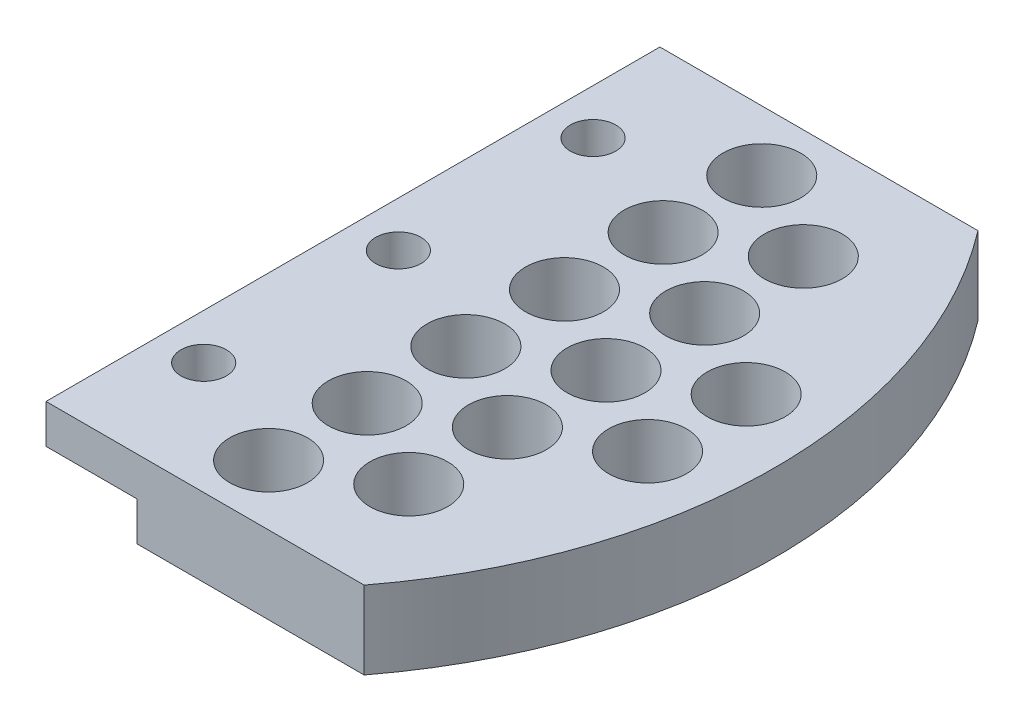
ISO-10303-21;
HEADER;
FILE_DESCRIPTION(('STEP AP214'),'2;1');
FILE_NAME('part.step','',(''),(''),'','','');
FILE_SCHEMA(('AUTOMOTIVE_DESIGN { 1 0 10303 214 1 1 1 1 }'));
ENDSEC;
DATA;
#1=APPLICATION_CONTEXT('core data for automotive mechanical design processes');
#2=APPLICATION_PROTOCOL_DEFINITION('international standard','automotive_design',2000,#1);
#3=PRODUCT_CONTEXT('',#1,'mechanical');
#4=PRODUCT('Part','Part','',(#3));
#5=PRODUCT_RELATED_PRODUCT_CATEGORY('part','',(#4));
#6=PRODUCT_DEFINITION_FORMATION('','',#4);
#7=PRODUCT_DEFINITION_CONTEXT('part definition',#1,'design');
#8=PRODUCT_DEFINITION('design','',#6,#7);
#9=PRODUCT_DEFINITION_SHAPE('','',#8);
#10=(LENGTH_UNIT() NAMED_UNIT(*) SI_UNIT(.MILLI.,.METRE.));
#11=(NAMED_UNIT(*) PLANE_ANGLE_UNIT() SI_UNIT($,.RADIAN.));
#12=(NAMED_UNIT(*) SI_UNIT($,.STERADIAN.) SOLID_ANGLE_UNIT());
#13=UNCERTAINTY_MEASURE_WITH_UNIT(LENGTH_MEASURE(1.E-05),#10,'distance_accuracy_value','');
#14=(GEOMETRIC_REPRESENTATION_CONTEXT(3) GLOBAL_UNCERTAINTY_ASSIGNED_CONTEXT((#13)) GLOBAL_UNIT_ASSIGNED_CONTEXT((#10,
#11,#12)) REPRESENTATION_CONTEXT('',''));
#15=CARTESIAN_POINT('',(0.,0.,0.));
#16=DIRECTION('',(0.,0.,1.));
#17=DIRECTION('',(1.,0.,0.));
#18=AXIS2_PLACEMENT_3D('',#15,#16,#17);
#19=CARTESIAN_POINT('',(13.5,0.,-23.65));
#20=DIRECTION('',(1.,0.,0.));
#21=DIRECTION('',(0.,1.,0.));
#22=AXIS2_PLACEMENT_3D('',#19,#20,#21);
#23=PLANE('',#22);
#24=DIRECTION('',(0.,0.,1.));
#25=VECTOR('',#24,1.);
#26=CARTESIAN_POINT('',(13.5,3.,0.));
#27=LINE('',#26,#25);
#28=CARTESIAN_POINT('',(13.5,3.,-23.65));
#29=VERTEX_POINT('',#28);
#30=CARTESIAN_POINT('',(13.5,3.,23.65));
#31=VERTEX_POINT('',#30);
#32=EDGE_CURVE('E28',#29,#31,#27,.T.);
#33=ORIENTED_EDGE('',*,*,#32,.F.);
#34=DIRECTION('',(0.,1.,0.));
#35=VECTOR('',#34,1.);
#36=CARTESIAN_POINT('',(13.5,6.,-23.65));
#37=LINE('',#36,#35);
#38=CARTESIAN_POINT('',(13.5,0.,-23.65));
#39=VERTEX_POINT('',#38);
#40=EDGE_CURVE('E439',#39,#29,#37,.T.);
#41=ORIENTED_EDGE('',*,*,#40,.F.);
#42=DIRECTION('',(0.,0.,1.));
#43=VECTOR('',#42,1.);
#44=CARTESIAN_POINT('',(13.5,0.,0.));
#45=LINE('',#44,#43);
#46=CARTESIAN_POINT('',(13.5,0.,23.65));
#47=VERTEX_POINT('',#46);
#48=EDGE_CURVE('E11',#39,#47,#45,.T.);
#49=ORIENTED_EDGE('',*,*,#48,.T.);
#50=DIRECTION('',(0.,1.,0.));
#51=VECTOR('',#50,1.);
#52=CARTESIAN_POINT('',(13.5,6.,23.65));
#53=LINE('',#52,#51);
#54=EDGE_CURVE('E277',#47,#31,#53,.T.);
#55=ORIENTED_EDGE('',*,*,#54,.T.);
#56=EDGE_LOOP('',(#33,#41,#49,#55));
#57=FACE_BOUND('',#56,.T.);
#58=ADVANCED_FACE('F17',(#57),#23,.F.);
#59=CARTESIAN_POINT('',(0.,0.,0.));
#60=DIRECTION('',(0.,1.,0.));
#61=DIRECTION('',(1.,0.,0.));
#62=AXIS2_PLACEMENT_3D('',#59,#60,#61);
#63=PLANE('',#62);
#64=CARTESIAN_POINT('',(19.,0.,-11.4));
#65=DIRECTION('',(0.,1.,0.));
#66=DIRECTION('',(0.,0.,1.));
#67=AXIS2_PLACEMENT_3D('',#64,#65,#66);
#68=CIRCLE('',#67,3.);
#69=CARTESIAN_POINT('',(19.,0.,-14.4));
#70=VERTEX_POINT('',#69);
#71=EDGE_CURVE('E300',#70,#70,#68,.T.);
#72=ORIENTED_EDGE('',*,*,#71,.T.);
#73=EDGE_LOOP('',(#72));
#74=FACE_BOUND('',#73,.T.);
#75=CARTESIAN_POINT('',(19.,0.,-3.8));
#76=DIRECTION('',(0.,1.,0.));
#77=DIRECTION('',(0.,0.,1.));
#78=AXIS2_PLACEMENT_3D('',#75,#76,#77);
#79=CIRCLE('',#78,3.);
#80=CARTESIAN_POINT('',(19.,0.,-6.8));
#81=VERTEX_POINT('',#80);
#82=EDGE_CURVE('E234',#81,#81,#79,.T.);
#83=ORIENTED_EDGE('',*,*,#82,.T.);
#84=EDGE_LOOP('',(#83));
#85=FACE_BOUND('',#84,.T.);
#86=CARTESIAN_POINT('',(19.,0.,3.8));
#87=DIRECTION('',(0.,1.,0.));
#88=DIRECTION('',(0.,0.,1.));
#89=AXIS2_PLACEMENT_3D('',#86,#87,#88);
#90=CIRCLE('',#89,3.);
#91=CARTESIAN_POINT('',(19.,0.,0.8));
#92=VERTEX_POINT('',#91);
#93=EDGE_CURVE('E357',#92,#92,#90,.T.);
#94=ORIENTED_EDGE('',*,*,#93,.T.);
#95=EDGE_LOOP('',(#94));
#96=FACE_BOUND('',#95,.T.);
#97=CARTESIAN_POINT('',(19.,0.,11.4));
#98=DIRECTION('',(0.,1.,0.));
#99=DIRECTION('',(0.,0.,1.));
#100=AXIS2_PLACEMENT_3D('',#97,#98,#99);
#101=CIRCLE('',#100,3.);
#102=CARTESIAN_POINT('',(19.,0.,8.4));
#103=VERTEX_POINT('',#102);
#104=EDGE_CURVE('E239',#103,#103,#101,.T.);
#105=ORIENTED_EDGE('',*,*,#104,.T.);
#106=EDGE_LOOP('',(#105));
#107=FACE_BOUND('',#106,.T.);
#108=CARTESIAN_POINT('',(19.,0.,19.));
#109=DIRECTION('',(0.,1.,0.));
#110=DIRECTION('',(0.,0.,1.));
#111=AXIS2_PLACEMENT_3D('',#108,#109,#110);
#112=CIRCLE('',#111,3.);
#113=CARTESIAN_POINT('',(19.,0.,16.));
#114=VERTEX_POINT('',#113);
#115=EDGE_CURVE('E269',#114,#114,#112,.T.);
#116=ORIENTED_EDGE('',*,*,#115,.T.);
#117=EDGE_LOOP('',(#116));
#118=FACE_BOUND('',#117,.T.);
#119=CARTESIAN_POINT('',(26.,0.,-15.2));
#120=DIRECTION('',(0.,1.,0.));
#121=DIRECTION('',(0.,0.,1.));
#122=AXIS2_PLACEMENT_3D('',#119,#120,#121);
#123=CIRCLE('',#122,3.);
#124=CARTESIAN_POINT('',(26.,0.,-18.2));
#125=VERTEX_POINT('',#124);
#126=EDGE_CURVE('E241',#125,#125,#123,.T.);
#127=ORIENTED_EDGE('',*,*,#126,.T.);
#128=EDGE_LOOP('',(#127));
#129=FACE_BOUND('',#128,.T.);
#130=CARTESIAN_POINT('',(26.,0.,-7.6));
#131=DIRECTION('',(0.,1.,0.));
#132=DIRECTION('',(0.,0.,1.));
#133=AXIS2_PLACEMENT_3D('',#130,#131,#132);
#134=CIRCLE('',#133,3.);
#135=CARTESIAN_POINT('',(26.,0.,-10.6));
#136=VERTEX_POINT('',#135);
#137=EDGE_CURVE('E261',#136,#136,#134,.T.);
#138=ORIENTED_EDGE('',*,*,#137,.T.);
#139=EDGE_LOOP('',(#138));
#140=FACE_BOUND('',#139,.T.);
#141=CARTESIAN_POINT('',(26.,0.,0.));
#142=DIRECTION('',(0.,1.,0.));
#143=DIRECTION('',(0.,0.,1.));
#144=AXIS2_PLACEMENT_3D('',#141,#142,#143);
#145=CIRCLE('',#144,3.);
#146=CARTESIAN_POINT('',(26.,0.,-3.));
#147=VERTEX_POINT('',#146);
#148=EDGE_CURVE('E251',#147,#147,#145,.T.);
#149=ORIENTED_EDGE('',*,*,#148,.T.);
#150=EDGE_LOOP('',(#149));
#151=FACE_BOUND('',#150,.T.);
#152=CARTESIAN_POINT('',(26.,0.,7.6));
#153=DIRECTION('',(0.,1.,0.));
#154=DIRECTION('',(0.,0.,1.));
#155=AXIS2_PLACEMENT_3D('',#152,#153,#154);
#156=CIRCLE('',#155,3.);
#157=CARTESIAN_POINT('',(26.,0.,4.6));
#158=VERTEX_POINT('',#157);
#159=EDGE_CURVE('E347',#158,#158,#156,.T.);
#160=ORIENTED_EDGE('',*,*,#159,.T.);
#161=EDGE_LOOP('',(#160));
#162=FACE_BOUND('',#161,.T.);
#163=CARTESIAN_POINT('',(26.,0.,15.2));
#164=DIRECTION('',(0.,1.,0.));
#165=DIRECTION('',(0.,0.,1.));
#166=AXIS2_PLACEMENT_3D('',#163,#164,#165);
#167=CIRCLE('',#166,3.);
#168=CARTESIAN_POINT('',(26.,0.,12.2));
#169=VERTEX_POINT('',#168);
#170=EDGE_CURVE('E346',#169,#169,#167,.T.);
#171=ORIENTED_EDGE('',*,*,#170,.T.);
#172=EDGE_LOOP('',(#171));
#173=FACE_BOUND('',#172,.T.);
#174=CARTESIAN_POINT('',(33.,0.,-3.8));
#175=DIRECTION('',(0.,1.,0.));
#176=DIRECTION('',(0.,0.,1.));
#177=AXIS2_PLACEMENT_3D('',#174,#175,#176);
#178=CIRCLE('',#177,3.);
#179=CARTESIAN_POINT('',(33.,0.,-6.8));
#180=VERTEX_POINT('',#179);
#181=EDGE_CURVE('E308',#180,#180,#178,.T.);
#182=ORIENTED_EDGE('',*,*,#181,.T.);
#183=EDGE_LOOP('',(#182));
#184=FACE_BOUND('',#183,.T.);
#185=CARTESIAN_POINT('',(33.,0.,3.8));
#186=DIRECTION('',(0.,1.,0.));
#187=DIRECTION('',(0.,0.,1.));
#188=AXIS2_PLACEMENT_3D('',#185,#186,#187);
#189=CIRCLE('',#188,3.);
#190=CARTESIAN_POINT('',(33.,0.,0.8));
#191=VERTEX_POINT('',#190);
#192=EDGE_CURVE('E21',#191,#191,#189,.T.);
#193=ORIENTED_EDGE('',*,*,#192,.T.);
#194=EDGE_LOOP('',(#193));
#195=FACE_BOUND('',#194,.T.);
#196=CARTESIAN_POINT('',(19.,0.,-19.));
#197=DIRECTION('',(0.,1.,0.));
#198=DIRECTION('',(0.,0.,1.));
#199=AXIS2_PLACEMENT_3D('',#196,#197,#198);
#200=CIRCLE('',#199,3.);
#201=CARTESIAN_POINT('',(19.,0.,-22.));
#202=VERTEX_POINT('',#201);
#203=EDGE_CURVE('E256',#202,#202,#200,.T.);
#204=ORIENTED_EDGE('',*,*,#203,.T.);
#205=EDGE_LOOP('',(#204));
#206=FACE_BOUND('',#205,.T.);
#207=CARTESIAN_POINT('',(0.,0.,0.));
#208=DIRECTION('',(0.,1.,0.));
#209=DIRECTION('',(0.,0.,1.));
#210=AXIS2_PLACEMENT_3D('',#207,#208,#209);
#211=CIRCLE('',#210,39.);
#212=CARTESIAN_POINT('',(31.01092549409,0.,23.65));
#213=VERTEX_POINT('',#212);
#214=CARTESIAN_POINT('',(31.01092549409,0.,-23.65));
#215=VERTEX_POINT('',#214);
#216=EDGE_CURVE('E208',#213,#215,#211,.T.);
#217=ORIENTED_EDGE('',*,*,#216,.F.);
#218=DIRECTION('',(-1.,0.,0.));
#219=VECTOR('',#218,1.);
#220=CARTESIAN_POINT('',(32.51938905288,0.,23.65));
#221=LINE('',#220,#219);
#222=EDGE_CURVE('E204',#213,#47,#221,.T.);
#223=ORIENTED_EDGE('',*,*,#222,.T.);
#224=ORIENTED_EDGE('',*,*,#48,.F.);
#225=DIRECTION('',(-1.,0.,0.));
#226=VECTOR('',#225,1.);
#227=CARTESIAN_POINT('',(32.51938905288,0.,-23.65));
#228=LINE('',#227,#226);
#229=EDGE_CURVE('E364',#215,#39,#228,.T.);
#230=ORIENTED_EDGE('',*,*,#229,.F.);
#231=EDGE_LOOP('',(#217,#223,#224,#230));
#232=FACE_BOUND('',#231,.T.);
#233=ADVANCED_FACE('F462',(#74,#85,#96,#107,#118,#129,#140,#151,#162,#173,#184,#195,#206,#232),
#63,.F.);
#234=CARTESIAN_POINT('',(0.,3.,0.));
#235=DIRECTION('',(0.,-1.,0.));
#236=DIRECTION('',(0.,0.,-1.));
#237=AXIS2_PLACEMENT_3D('',#234,#235,#236);
#238=PLANE('',#237);
#239=CARTESIAN_POINT('',(10.,3.,0.));
#240=DIRECTION('',(0.,1.,0.));
#241=DIRECTION('',(0.,0.,-1.));
#242=AXIS2_PLACEMENT_3D('',#239,#240,#241);
#243=CIRCLE('',#242,1.75);
#244=CARTESIAN_POINT('',(10.,3.,1.75));
#245=VERTEX_POINT('',#244);
#246=EDGE_CURVE('E253',#245,#245,#243,.T.);
#247=ORIENTED_EDGE('',*,*,#246,.T.);
#248=EDGE_LOOP('',(#247));
#249=FACE_BOUND('',#248,.T.);
#250=CARTESIAN_POINT('',(10.,3.,15.));
#251=DIRECTION('',(0.,1.,0.));
#252=DIRECTION('',(0.,0.,-1.));
#253=AXIS2_PLACEMENT_3D('',#250,#251,#252);
#254=CIRCLE('',#253,1.75);
#255=CARTESIAN_POINT('',(10.,3.,16.75));
#256=VERTEX_POINT('',#255);
#257=EDGE_CURVE('E283',#256,#256,#254,.T.);
#258=ORIENTED_EDGE('',*,*,#257,.T.);
#259=EDGE_LOOP('',(#258));
#260=FACE_BOUND('',#259,.T.);
#261=CARTESIAN_POINT('',(10.,3.,-15.));
#262=DIRECTION('',(0.,1.,0.));
#263=DIRECTION('',(0.,0.,-1.));
#264=AXIS2_PLACEMENT_3D('',#261,#262,#263);
#265=CIRCLE('',#264,1.75);
#266=CARTESIAN_POINT('',(10.,3.,-13.25));
#267=VERTEX_POINT('',#266);
#268=EDGE_CURVE('E302',#267,#267,#265,.T.);
#269=ORIENTED_EDGE('',*,*,#268,.T.);
#270=EDGE_LOOP('',(#269));
#271=FACE_BOUND('',#270,.T.);
#272=ORIENTED_EDGE('',*,*,#32,.T.);
#273=DIRECTION('',(-1.,0.,0.));
#274=VECTOR('',#273,1.);
#275=CARTESIAN_POINT('',(32.51938905288,3.,23.65));
#276=LINE('',#275,#274);
#277=CARTESIAN_POINT('',(6.5,3.,23.65));
#278=VERTEX_POINT('',#277);
#279=EDGE_CURVE('E274',#31,#278,#276,.T.);
#280=ORIENTED_EDGE('',*,*,#279,.T.);
#281=DIRECTION('',(0.,0.,-1.));
#282=VECTOR('',#281,1.);
#283=CARTESIAN_POINT('',(6.5,3.,24.58651758746));
#284=LINE('',#283,#282);
#285=CARTESIAN_POINT('',(6.5,3.,-23.65));
#286=VERTEX_POINT('',#285);
#287=EDGE_CURVE('E265',#278,#286,#284,.T.);
#288=ORIENTED_EDGE('',*,*,#287,.T.);
#289=DIRECTION('',(-1.,0.,0.));
#290=VECTOR('',#289,1.);
#291=CARTESIAN_POINT('',(32.51938905288,3.,-23.65));
#292=LINE('',#291,#290);
#293=EDGE_CURVE('E417',#29,#286,#292,.T.);
#294=ORIENTED_EDGE('',*,*,#293,.F.);
#295=EDGE_LOOP('',(#272,#280,#288,#294));
#296=FACE_BOUND('',#295,.T.);
#297=ADVANCED_FACE('F483',(#249,#260,#271,#296),#238,.T.);
#298=CARTESIAN_POINT('',(32.51938905288,6.,23.65));
#299=DIRECTION('',(0.,0.,-1.));
#300=DIRECTION('',(0.,-1.,0.));
#301=AXIS2_PLACEMENT_3D('',#298,#299,#300);
#302=PLANE('',#301);
#303=ORIENTED_EDGE('',*,*,#222,.F.);
#304=DIRECTION('',(0.,-1.,0.));
#305=VECTOR('',#304,1.);
#306=CARTESIAN_POINT('',(31.01092549409,0.,23.65));
#307=LINE('',#306,#305);
#308=CARTESIAN_POINT('',(31.01092549409,6.,23.65));
#309=VERTEX_POINT('',#308);
#310=EDGE_CURVE('E195',#309,#213,#307,.T.);
#311=ORIENTED_EDGE('',*,*,#310,.F.);
#312=DIRECTION('',(1.,0.,0.));
#313=VECTOR('',#312,1.);
#314=CARTESIAN_POINT('',(0.,6.,23.65));
#315=LINE('',#314,#313);
#316=CARTESIAN_POINT('',(6.5,6.,23.65));
#317=VERTEX_POINT('',#316);
#318=EDGE_CURVE('E200',#317,#309,#315,.T.);
#319=ORIENTED_EDGE('',*,*,#318,.F.);
#320=DIRECTION('',(0.,-1.,0.));
#321=VECTOR('',#320,1.);
#322=CARTESIAN_POINT('',(6.5,6.,23.65));
#323=LINE('',#322,#321);
#324=EDGE_CURVE('E272',#317,#278,#323,.T.);
#325=ORIENTED_EDGE('',*,*,#324,.T.);
#326=ORIENTED_EDGE('',*,*,#279,.F.);
#327=ORIENTED_EDGE('',*,*,#54,.F.);
#328=EDGE_LOOP('',(#303,#311,#319,#325,#326,#327));
#329=FACE_BOUND('',#328,.T.);
#330=ADVANCED_FACE('F197',(#329),#302,.F.);
#331=CARTESIAN_POINT('',(0.,0.,0.));
#332=DIRECTION('',(0.,1.,0.));
#333=DIRECTION('',(0.,0.,1.));
#334=AXIS2_PLACEMENT_3D('',#331,#332,#333);
#335=CYLINDRICAL_SURFACE('',#334,39.);
#336=ORIENTED_EDGE('',*,*,#216,.T.);
#337=DIRECTION('',(0.,-1.,0.));
#338=VECTOR('',#337,1.);
#339=CARTESIAN_POINT('',(31.01092549409,6.,-23.65));
#340=LINE('',#339,#338);
#341=CARTESIAN_POINT('',(31.01092549409,6.,-23.65));
#342=VERTEX_POINT('',#341);
#343=EDGE_CURVE('E214',#342,#215,#340,.T.);
#344=ORIENTED_EDGE('',*,*,#343,.F.);
#345=CARTESIAN_POINT('',(0.,6.,0.));
#346=DIRECTION('',(0.,1.,0.));
#347=DIRECTION('',(0.,0.,1.));
#348=AXIS2_PLACEMENT_3D('',#345,#346,#347);
#349=CIRCLE('',#348,39.);
#350=EDGE_CURVE('E211',#309,#342,#349,.T.);
#351=ORIENTED_EDGE('',*,*,#350,.F.);
#352=ORIENTED_EDGE('',*,*,#310,.T.);
#353=EDGE_LOOP('',(#336,#344,#351,#352));
#354=FACE_BOUND('',#353,.T.);
#355=ADVANCED_FACE('F212',(#354),#335,.T.);
#356=CARTESIAN_POINT('',(32.51938905288,6.,-23.65));
#357=DIRECTION('',(0.,0.,-1.));
#358=DIRECTION('',(0.,-1.,0.));
#359=AXIS2_PLACEMENT_3D('',#356,#357,#358);
#360=PLANE('',#359);
#361=ORIENTED_EDGE('',*,*,#40,.T.);
#362=ORIENTED_EDGE('',*,*,#293,.T.);
#363=DIRECTION('',(0.,1.,0.));
#364=VECTOR('',#363,1.);
#365=CARTESIAN_POINT('',(6.5,6.,-23.65));
#366=LINE('',#365,#364);
#367=CARTESIAN_POINT('',(6.5,6.,-23.65));
#368=VERTEX_POINT('',#367);
#369=EDGE_CURVE('E219',#286,#368,#366,.T.);
#370=ORIENTED_EDGE('',*,*,#369,.T.);
#371=DIRECTION('',(-1.,0.,0.));
#372=VECTOR('',#371,1.);
#373=CARTESIAN_POINT('',(0.,6.,-23.65));
#374=LINE('',#373,#372);
#375=EDGE_CURVE('E230',#342,#368,#374,.T.);
#376=ORIENTED_EDGE('',*,*,#375,.F.);
#377=ORIENTED_EDGE('',*,*,#343,.T.);
#378=ORIENTED_EDGE('',*,*,#229,.T.);
#379=EDGE_LOOP('',(#361,#362,#370,#376,#377,#378));
#380=FACE_BOUND('',#379,.T.);
#381=ADVANCED_FACE('F541',(#380),#360,.T.);
#382=CARTESIAN_POINT('',(6.5,6.,24.58651758746));
#383=DIRECTION('',(1.,0.,0.));
#384=DIRECTION('',(0.,1.,0.));
#385=AXIS2_PLACEMENT_3D('',#382,#383,#384);
#386=PLANE('',#385);
#387=DIRECTION('',(0.,0.,1.));
#388=VECTOR('',#387,1.);
#389=CARTESIAN_POINT('',(6.5,6.,0.));
#390=LINE('',#389,#388);
#391=EDGE_CURVE('E223',#368,#317,#390,.T.);
#392=ORIENTED_EDGE('',*,*,#391,.F.);
#393=ORIENTED_EDGE('',*,*,#369,.F.);
#394=ORIENTED_EDGE('',*,*,#287,.F.);
#395=ORIENTED_EDGE('',*,*,#324,.F.);
#396=EDGE_LOOP('',(#392,#393,#394,#395));
#397=FACE_BOUND('',#396,.T.);
#398=ADVANCED_FACE('F471',(#397),#386,.F.);
#399=CARTESIAN_POINT('',(0.,6.,0.));
#400=DIRECTION('',(0.,1.,0.));
#401=DIRECTION('',(1.,0.,0.));
#402=AXIS2_PLACEMENT_3D('',#399,#400,#401);
#403=PLANE('',#402);
#404=CARTESIAN_POINT('',(19.,6.,-11.4));
#405=DIRECTION('',(0.,-1.,0.));
#406=DIRECTION('',(0.,0.,1.));
#407=AXIS2_PLACEMENT_3D('',#404,#405,#406);
#408=CIRCLE('',#407,3.);
#409=CARTESIAN_POINT('',(19.,6.,-14.4));
#410=VERTEX_POINT('',#409);
#411=EDGE_CURVE('E335',#410,#410,#408,.T.);
#412=ORIENTED_EDGE('',*,*,#411,.T.);
#413=EDGE_LOOP('',(#412));
#414=FACE_BOUND('',#413,.T.);
#415=CARTESIAN_POINT('',(19.,6.,-3.8));
#416=DIRECTION('',(0.,-1.,0.));
#417=DIRECTION('',(0.,0.,1.));
#418=AXIS2_PLACEMENT_3D('',#415,#416,#417);
#419=CIRCLE('',#418,3.);
#420=CARTESIAN_POINT('',(19.,6.,-6.8));
#421=VERTEX_POINT('',#420);
#422=EDGE_CURVE('E297',#421,#421,#419,.T.);
#423=ORIENTED_EDGE('',*,*,#422,.T.);
#424=EDGE_LOOP('',(#423));
#425=FACE_BOUND('',#424,.T.);
#426=CARTESIAN_POINT('',(19.,6.,3.8));
#427=DIRECTION('',(0.,-1.,0.));
#428=DIRECTION('',(0.,0.,1.));
#429=AXIS2_PLACEMENT_3D('',#426,#427,#428);
#430=CIRCLE('',#429,3.);
#431=CARTESIAN_POINT('',(19.,6.,0.8));
#432=VERTEX_POINT('',#431);
#433=EDGE_CURVE('E381',#432,#432,#430,.T.);
#434=ORIENTED_EDGE('',*,*,#433,.T.);
#435=EDGE_LOOP('',(#434));
#436=FACE_BOUND('',#435,.T.);
#437=CARTESIAN_POINT('',(19.,6.,11.4));
#438=DIRECTION('',(0.,-1.,0.));
#439=DIRECTION('',(0.,0.,1.));
#440=AXIS2_PLACEMENT_3D('',#437,#438,#439);
#441=CIRCLE('',#440,3.);
#442=CARTESIAN_POINT('',(19.,6.,8.4));
#443=VERTEX_POINT('',#442);
#444=EDGE_CURVE('E282',#443,#443,#441,.T.);
#445=ORIENTED_EDGE('',*,*,#444,.T.);
#446=EDGE_LOOP('',(#445));
#447=FACE_BOUND('',#446,.T.);
#448=CARTESIAN_POINT('',(19.,6.,19.));
#449=DIRECTION('',(0.,-1.,0.));
#450=DIRECTION('',(0.,0.,1.));
#451=AXIS2_PLACEMENT_3D('',#448,#449,#450);
#452=CIRCLE('',#451,3.);
#453=CARTESIAN_POINT('',(19.,6.,16.));
#454=VERTEX_POINT('',#453);
#455=EDGE_CURVE('E236',#454,#454,#452,.T.);
#456=ORIENTED_EDGE('',*,*,#455,.T.);
#457=EDGE_LOOP('',(#456));
#458=FACE_BOUND('',#457,.T.);
#459=CARTESIAN_POINT('',(26.,6.,-15.2));
#460=DIRECTION('',(0.,-1.,0.));
#461=DIRECTION('',(0.,0.,1.));
#462=AXIS2_PLACEMENT_3D('',#459,#460,#461);
#463=CIRCLE('',#462,3.);
#464=CARTESIAN_POINT('',(26.,6.,-18.2));
#465=VERTEX_POINT('',#464);
#466=EDGE_CURVE('E266',#465,#465,#463,.T.);
#467=ORIENTED_EDGE('',*,*,#466,.T.);
#468=EDGE_LOOP('',(#467));
#469=FACE_BOUND('',#468,.T.);
#470=CARTESIAN_POINT('',(26.,6.,-7.6));
#471=DIRECTION('',(0.,-1.,0.));
#472=DIRECTION('',(0.,0.,1.));
#473=AXIS2_PLACEMENT_3D('',#470,#471,#472);
#474=CIRCLE('',#473,3.);
#475=CARTESIAN_POINT('',(26.,6.,-10.6));
#476=VERTEX_POINT('',#475);
#477=EDGE_CURVE('E246',#476,#476,#474,.T.);
#478=ORIENTED_EDGE('',*,*,#477,.T.);
#479=EDGE_LOOP('',(#478));
#480=FACE_BOUND('',#479,.T.);
#481=CARTESIAN_POINT('',(26.,6.,0.));
#482=DIRECTION('',(0.,-1.,0.));
#483=DIRECTION('',(0.,0.,1.));
#484=AXIS2_PLACEMENT_3D('',#481,#482,#483);
#485=CIRCLE('',#484,3.);
#486=CARTESIAN_POINT('',(26.,6.,-3.));
#487=VERTEX_POINT('',#486);
#488=EDGE_CURVE('E258',#487,#487,#485,.T.);
#489=ORIENTED_EDGE('',*,*,#488,.T.);
#490=EDGE_LOOP('',(#489));
#491=FACE_BOUND('',#490,.T.);
#492=CARTESIAN_POINT('',(26.,6.,7.6));
#493=DIRECTION('',(0.,-1.,0.));
#494=DIRECTION('',(0.,0.,1.));
#495=AXIS2_PLACEMENT_3D('',#492,#493,#494);
#496=CIRCLE('',#495,3.);
#497=CARTESIAN_POINT('',(26.,6.,4.6));
#498=VERTEX_POINT('',#497);
#499=EDGE_CURVE('E247',#498,#498,#496,.T.);
#500=ORIENTED_EDGE('',*,*,#499,.T.);
#501=EDGE_LOOP('',(#500));
#502=FACE_BOUND('',#501,.T.);
#503=CARTESIAN_POINT('',(26.,6.,15.2));
#504=DIRECTION('',(0.,-1.,0.));
#505=DIRECTION('',(0.,0.,1.));
#506=AXIS2_PLACEMENT_3D('',#503,#504,#505);
#507=CIRCLE('',#506,3.);
#508=CARTESIAN_POINT('',(26.,6.,12.2));
#509=VERTEX_POINT('',#508);
#510=EDGE_CURVE('E351',#509,#509,#507,.T.);
#511=ORIENTED_EDGE('',*,*,#510,.T.);
#512=EDGE_LOOP('',(#511));
#513=FACE_BOUND('',#512,.T.);
#514=CARTESIAN_POINT('',(33.,6.,-3.8));
#515=DIRECTION('',(0.,-1.,0.));
#516=DIRECTION('',(0.,0.,1.));
#517=AXIS2_PLACEMENT_3D('',#514,#515,#516);
#518=CIRCLE('',#517,3.);
#519=CARTESIAN_POINT('',(33.,6.,-6.8));
#520=VERTEX_POINT('',#519);
#521=EDGE_CURVE('E342',#520,#520,#518,.T.);
#522=ORIENTED_EDGE('',*,*,#521,.T.);
#523=EDGE_LOOP('',(#522));
#524=FACE_BOUND('',#523,.T.);
#525=CARTESIAN_POINT('',(33.,6.,3.8));
#526=DIRECTION('',(0.,-1.,0.));
#527=DIRECTION('',(0.,0.,1.));
#528=AXIS2_PLACEMENT_3D('',#525,#526,#527);
#529=CIRCLE('',#528,3.);
#530=CARTESIAN_POINT('',(33.,6.,0.8));
#531=VERTEX_POINT('',#530);
#532=EDGE_CURVE('E306',#531,#531,#529,.T.);
#533=ORIENTED_EDGE('',*,*,#532,.T.);
#534=EDGE_LOOP('',(#533));
#535=FACE_BOUND('',#534,.T.);
#536=CARTESIAN_POINT('',(19.,6.,-19.));
#537=DIRECTION('',(0.,-1.,0.));
#538=DIRECTION('',(0.,0.,1.));
#539=AXIS2_PLACEMENT_3D('',#536,#537,#538);
#540=CIRCLE('',#539,3.);
#541=CARTESIAN_POINT('',(19.,6.,-22.));
#542=VERTEX_POINT('',#541);
#543=EDGE_CURVE('E327',#542,#542,#540,.T.);
#544=ORIENTED_EDGE('',*,*,#543,.T.);
#545=EDGE_LOOP('',(#544));
#546=FACE_BOUND('',#545,.T.);
#547=CARTESIAN_POINT('',(10.,6.,0.));
#548=DIRECTION('',(0.,-1.,0.));
#549=DIRECTION('',(0.,0.,-1.));
#550=AXIS2_PLACEMENT_3D('',#547,#548,#549);
#551=CIRCLE('',#550,1.75);
#552=CARTESIAN_POINT('',(10.,6.,1.75));
#553=VERTEX_POINT('',#552);
#554=EDGE_CURVE('E287',#553,#553,#551,.T.);
#555=ORIENTED_EDGE('',*,*,#554,.T.);
#556=EDGE_LOOP('',(#555));
#557=FACE_BOUND('',#556,.T.);
#558=CARTESIAN_POINT('',(10.,6.,15.));
#559=DIRECTION('',(0.,-1.,0.));
#560=DIRECTION('',(0.,0.,-1.));
#561=AXIS2_PLACEMENT_3D('',#558,#559,#560);
#562=CIRCLE('',#561,1.75);
#563=CARTESIAN_POINT('',(10.,6.,16.75));
#564=VERTEX_POINT('',#563);
#565=EDGE_CURVE('E304',#564,#564,#562,.T.);
#566=ORIENTED_EDGE('',*,*,#565,.T.);
#567=EDGE_LOOP('',(#566));
#568=FACE_BOUND('',#567,.T.);
#569=CARTESIAN_POINT('',(10.,6.,-15.));
#570=DIRECTION('',(0.,-1.,0.));
#571=DIRECTION('',(0.,0.,-1.));
#572=AXIS2_PLACEMENT_3D('',#569,#570,#571);
#573=CIRCLE('',#572,1.75);
#574=CARTESIAN_POINT('',(10.,6.,-13.25));
#575=VERTEX_POINT('',#574);
#576=EDGE_CURVE('E361',#575,#575,#573,.T.);
#577=ORIENTED_EDGE('',*,*,#576,.T.);
#578=EDGE_LOOP('',(#577));
#579=FACE_BOUND('',#578,.T.);
#580=ORIENTED_EDGE('',*,*,#375,.T.);
#581=ORIENTED_EDGE('',*,*,#391,.T.);
#582=ORIENTED_EDGE('',*,*,#318,.T.);
#583=ORIENTED_EDGE('',*,*,#350,.T.);
#584=EDGE_LOOP('',(#580,#581,#582,#583));
#585=FACE_BOUND('',#584,.T.);
#586=ADVANCED_FACE('F221',(#414,#425,#436,#447,#458,#469,#480,#491,#502,#513,#524,#535,#546,
#557,#568,#579,#585),#403,.T.);
#587=CARTESIAN_POINT('',(19.,6.,-11.4));
#588=DIRECTION('',(0.,1.,0.));
#589=DIRECTION('',(0.,0.,1.));
#590=AXIS2_PLACEMENT_3D('',#587,#588,#589);
#591=CYLINDRICAL_SURFACE('',#590,3.);
#592=ORIENTED_EDGE('',*,*,#71,.F.);
#593=DIRECTION('',(0.,1.,0.));
#594=VECTOR('',#593,1.);
#595=CARTESIAN_POINT('',(19.,6.,-14.4));
#596=LINE('',#595,#594);
#597=EDGE_CURVE('E338',#70,#410,#596,.T.);
#598=ORIENTED_EDGE('',*,*,#597,.T.);
#599=ORIENTED_EDGE('',*,*,#411,.F.);
#600=ORIENTED_EDGE('',*,*,#597,.F.);
#601=EDGE_LOOP('',(#592,#598,#599,#600));
#602=FACE_BOUND('',#601,.T.);
#603=ADVANCED_FACE('F470',(#602),#591,.F.);
#604=CARTESIAN_POINT('',(19.,6.,-3.8));
#605=DIRECTION('',(0.,1.,0.));
#606=DIRECTION('',(0.,0.,1.));
#607=AXIS2_PLACEMENT_3D('',#604,#605,#606);
#608=CYLINDRICAL_SURFACE('',#607,3.);
#609=ORIENTED_EDGE('',*,*,#82,.F.);
#610=DIRECTION('',(0.,1.,0.));
#611=VECTOR('',#610,1.);
#612=CARTESIAN_POINT('',(19.,6.,-6.8));
#613=LINE('',#612,#611);
#614=EDGE_CURVE('E301',#81,#421,#613,.T.);
#615=ORIENTED_EDGE('',*,*,#614,.T.);
#616=ORIENTED_EDGE('',*,*,#422,.F.);
#617=ORIENTED_EDGE('',*,*,#614,.F.);
#618=EDGE_LOOP('',(#609,#615,#616,#617));
#619=FACE_BOUND('',#618,.T.);
#620=ADVANCED_FACE('F504',(#619),#608,.F.);
#621=CARTESIAN_POINT('',(19.,6.,3.8));
#622=DIRECTION('',(0.,1.,0.));
#623=DIRECTION('',(0.,0.,1.));
#624=AXIS2_PLACEMENT_3D('',#621,#622,#623);
#625=CYLINDRICAL_SURFACE('',#624,3.);
#626=ORIENTED_EDGE('',*,*,#93,.F.);
#627=DIRECTION('',(0.,1.,0.));
#628=VECTOR('',#627,1.);
#629=CARTESIAN_POINT('',(19.,6.,0.8));
#630=LINE('',#629,#628);
#631=EDGE_CURVE('E377',#92,#432,#630,.T.);
#632=ORIENTED_EDGE('',*,*,#631,.T.);
#633=ORIENTED_EDGE('',*,*,#433,.F.);
#634=ORIENTED_EDGE('',*,*,#631,.F.);
#635=EDGE_LOOP('',(#626,#632,#633,#634));
#636=FACE_BOUND('',#635,.T.);
#637=ADVANCED_FACE('F733',(#636),#625,.F.);
#638=CARTESIAN_POINT('',(19.,6.,11.4));
#639=DIRECTION('',(0.,1.,0.));
#640=DIRECTION('',(0.,0.,1.));
#641=AXIS2_PLACEMENT_3D('',#638,#639,#640);
#642=CYLINDRICAL_SURFACE('',#641,3.);
#643=ORIENTED_EDGE('',*,*,#104,.F.);
#644=DIRECTION('',(0.,1.,0.));
#645=VECTOR('',#644,1.);
#646=CARTESIAN_POINT('',(19.,6.,8.4));
#647=LINE('',#646,#645);
#648=EDGE_CURVE('E278',#103,#443,#647,.T.);
#649=ORIENTED_EDGE('',*,*,#648,.T.);
#650=ORIENTED_EDGE('',*,*,#444,.F.);
#651=ORIENTED_EDGE('',*,*,#648,.F.);
#652=EDGE_LOOP('',(#643,#649,#650,#651));
#653=FACE_BOUND('',#652,.T.);
#654=ADVANCED_FACE('F551',(#653),#642,.F.);
#655=CARTESIAN_POINT('',(19.,6.,19.));
#656=DIRECTION('',(0.,1.,0.));
#657=DIRECTION('',(0.,0.,1.));
#658=AXIS2_PLACEMENT_3D('',#655,#656,#657);
#659=CYLINDRICAL_SURFACE('',#658,3.);
#660=ORIENTED_EDGE('',*,*,#115,.F.);
#661=DIRECTION('',(0.,1.,0.));
#662=VECTOR('',#661,1.);
#663=CARTESIAN_POINT('',(19.,6.,16.));
#664=LINE('',#663,#662);
#665=EDGE_CURVE('E240',#114,#454,#664,.T.);
#666=ORIENTED_EDGE('',*,*,#665,.T.);
#667=ORIENTED_EDGE('',*,*,#455,.F.);
#668=ORIENTED_EDGE('',*,*,#665,.F.);
#669=EDGE_LOOP('',(#660,#666,#667,#668));
#670=FACE_BOUND('',#669,.T.);
#671=ADVANCED_FACE('F544',(#670),#659,.F.);
#672=CARTESIAN_POINT('',(26.,6.,-15.2));
#673=DIRECTION('',(0.,1.,0.));
#674=DIRECTION('',(0.,0.,1.));
#675=AXIS2_PLACEMENT_3D('',#672,#673,#674);
#676=CYLINDRICAL_SURFACE('',#675,3.);
#677=ORIENTED_EDGE('',*,*,#126,.F.);
#678=DIRECTION('',(0.,1.,0.));
#679=VECTOR('',#678,1.);
#680=CARTESIAN_POINT('',(26.,6.,-18.2));
#681=LINE('',#680,#679);
#682=EDGE_CURVE('E245',#125,#465,#681,.T.);
#683=ORIENTED_EDGE('',*,*,#682,.T.);
#684=ORIENTED_EDGE('',*,*,#466,.F.);
#685=ORIENTED_EDGE('',*,*,#682,.F.);
#686=EDGE_LOOP('',(#677,#683,#684,#685));
#687=FACE_BOUND('',#686,.T.);
#688=ADVANCED_FACE('F542',(#687),#676,.F.);
#689=CARTESIAN_POINT('',(26.,6.,-7.6));
#690=DIRECTION('',(0.,1.,0.));
#691=DIRECTION('',(0.,0.,1.));
#692=AXIS2_PLACEMENT_3D('',#689,#690,#691);
#693=CYLINDRICAL_SURFACE('',#692,3.);
#694=ORIENTED_EDGE('',*,*,#137,.F.);
#695=DIRECTION('',(0.,1.,0.));
#696=VECTOR('',#695,1.);
#697=CARTESIAN_POINT('',(26.,6.,-10.6));
#698=LINE('',#697,#696);
#699=EDGE_CURVE('E331',#136,#476,#698,.T.);
#700=ORIENTED_EDGE('',*,*,#699,.T.);
#701=ORIENTED_EDGE('',*,*,#477,.F.);
#702=ORIENTED_EDGE('',*,*,#699,.F.);
#703=EDGE_LOOP('',(#694,#700,#701,#702));
#704=FACE_BOUND('',#703,.T.);
#705=ADVANCED_FACE('F517',(#704),#693,.F.);
#706=CARTESIAN_POINT('',(26.,6.,0.));
#707=DIRECTION('',(0.,1.,0.));
#708=DIRECTION('',(0.,0.,1.));
#709=AXIS2_PLACEMENT_3D('',#706,#707,#708);
#710=CYLINDRICAL_SURFACE('',#709,3.);
#711=ORIENTED_EDGE('',*,*,#148,.F.);
#712=DIRECTION('',(0.,1.,0.));
#713=VECTOR('',#712,1.);
#714=CARTESIAN_POINT('',(26.,6.,-3.));
#715=LINE('',#714,#713);
#716=EDGE_CURVE('E262',#147,#487,#715,.T.);
#717=ORIENTED_EDGE('',*,*,#716,.T.);
#718=ORIENTED_EDGE('',*,*,#488,.F.);
#719=ORIENTED_EDGE('',*,*,#716,.F.);
#720=EDGE_LOOP('',(#711,#717,#718,#719));
#721=FACE_BOUND('',#720,.T.);
#722=ADVANCED_FACE('F509',(#721),#710,.F.);
#723=CARTESIAN_POINT('',(26.,6.,7.6));
#724=DIRECTION('',(0.,1.,0.));
#725=DIRECTION('',(0.,0.,1.));
#726=AXIS2_PLACEMENT_3D('',#723,#724,#725);
#727=CYLINDRICAL_SURFACE('',#726,3.);
#728=ORIENTED_EDGE('',*,*,#159,.F.);
#729=DIRECTION('',(0.,1.,0.));
#730=VECTOR('',#729,1.);
#731=CARTESIAN_POINT('',(26.,6.,4.6));
#732=LINE('',#731,#730);
#733=EDGE_CURVE('E252',#158,#498,#732,.T.);
#734=ORIENTED_EDGE('',*,*,#733,.T.);
#735=ORIENTED_EDGE('',*,*,#499,.F.);
#736=ORIENTED_EDGE('',*,*,#733,.F.);
#737=EDGE_LOOP('',(#728,#734,#735,#736));
#738=FACE_BOUND('',#737,.T.);
#739=ADVANCED_FACE('F506',(#738),#727,.F.);
#740=CARTESIAN_POINT('',(26.,6.,15.2));
#741=DIRECTION('',(0.,1.,0.));
#742=DIRECTION('',(0.,0.,1.));
#743=AXIS2_PLACEMENT_3D('',#740,#741,#742);
#744=CYLINDRICAL_SURFACE('',#743,3.);
#745=ORIENTED_EDGE('',*,*,#170,.F.);
#746=DIRECTION('',(0.,1.,0.));
#747=VECTOR('',#746,1.);
#748=CARTESIAN_POINT('',(26.,6.,12.2));
#749=LINE('',#748,#747);
#750=EDGE_CURVE('E390',#169,#509,#749,.T.);
#751=ORIENTED_EDGE('',*,*,#750,.T.);
#752=ORIENTED_EDGE('',*,*,#510,.F.);
#753=ORIENTED_EDGE('',*,*,#750,.F.);
#754=EDGE_LOOP('',(#745,#751,#752,#753));
#755=FACE_BOUND('',#754,.T.);
#756=ADVANCED_FACE('F508',(#755),#744,.F.);
#757=CARTESIAN_POINT('',(33.,6.,-3.8));
#758=DIRECTION('',(0.,1.,0.));
#759=DIRECTION('',(0.,0.,1.));
#760=AXIS2_PLACEMENT_3D('',#757,#758,#759);
#761=CYLINDRICAL_SURFACE('',#760,3.);
#762=ORIENTED_EDGE('',*,*,#181,.F.);
#763=DIRECTION('',(0.,1.,0.));
#764=VECTOR('',#763,1.);
#765=CARTESIAN_POINT('',(33.,6.,-6.8));
#766=LINE('',#765,#764);
#767=EDGE_CURVE('E317',#180,#520,#766,.T.);
#768=ORIENTED_EDGE('',*,*,#767,.T.);
#769=ORIENTED_EDGE('',*,*,#521,.F.);
#770=ORIENTED_EDGE('',*,*,#767,.F.);
#771=EDGE_LOOP('',(#762,#768,#769,#770));
#772=FACE_BOUND('',#771,.T.);
#773=ADVANCED_FACE('F515',(#772),#761,.F.);
#774=CARTESIAN_POINT('',(33.,6.,3.8));
#775=DIRECTION('',(0.,1.,0.));
#776=DIRECTION('',(0.,0.,1.));
#777=AXIS2_PLACEMENT_3D('',#774,#775,#776);
#778=CYLINDRICAL_SURFACE('',#777,3.);
#779=ORIENTED_EDGE('',*,*,#192,.F.);
#780=DIRECTION('',(0.,1.,0.));
#781=VECTOR('',#780,1.);
#782=CARTESIAN_POINT('',(33.,6.,0.8));
#783=LINE('',#782,#781);
#784=EDGE_CURVE('E309',#191,#531,#783,.T.);
#785=ORIENTED_EDGE('',*,*,#784,.T.);
#786=ORIENTED_EDGE('',*,*,#532,.F.);
#787=ORIENTED_EDGE('',*,*,#784,.F.);
#788=EDGE_LOOP('',(#779,#785,#786,#787));
#789=FACE_BOUND('',#788,.T.);
#790=ADVANCED_FACE('F526',(#789),#778,.F.);
#791=CARTESIAN_POINT('',(19.,6.,-19.));
#792=DIRECTION('',(0.,1.,0.));
#793=DIRECTION('',(0.,0.,1.));
#794=AXIS2_PLACEMENT_3D('',#791,#792,#793);
#795=CYLINDRICAL_SURFACE('',#794,3.);
#796=ORIENTED_EDGE('',*,*,#203,.F.);
#797=DIRECTION('',(0.,1.,0.));
#798=VECTOR('',#797,1.);
#799=CARTESIAN_POINT('',(19.,6.,-22.));
#800=LINE('',#799,#798);
#801=EDGE_CURVE('E365',#202,#542,#800,.T.);
#802=ORIENTED_EDGE('',*,*,#801,.T.);
#803=ORIENTED_EDGE('',*,*,#543,.F.);
#804=ORIENTED_EDGE('',*,*,#801,.F.);
#805=EDGE_LOOP('',(#796,#802,#803,#804));
#806=FACE_BOUND('',#805,.T.);
#807=ADVANCED_FACE('F465',(#806),#795,.F.);
#808=CARTESIAN_POINT('',(10.,3.,0.));
#809=DIRECTION('',(0.,-1.,0.));
#810=DIRECTION('',(0.,0.,-1.));
#811=AXIS2_PLACEMENT_3D('',#808,#809,#810);
#812=CYLINDRICAL_SURFACE('',#811,1.75);
#813=ORIENTED_EDGE('',*,*,#554,.F.);
#814=DIRECTION('',(0.,-1.,0.));
#815=VECTOR('',#814,1.);
#816=CARTESIAN_POINT('',(10.,3.,1.75));
#817=LINE('',#816,#815);
#818=EDGE_CURVE('E257',#553,#245,#817,.T.);
#819=ORIENTED_EDGE('',*,*,#818,.T.);
#820=ORIENTED_EDGE('',*,*,#246,.F.);
#821=ORIENTED_EDGE('',*,*,#818,.F.);
#822=EDGE_LOOP('',(#813,#819,#820,#821));
#823=FACE_BOUND('',#822,.T.);
#824=ADVANCED_FACE('F533',(#823),#812,.F.);
#825=CARTESIAN_POINT('',(10.,3.,15.));
#826=DIRECTION('',(0.,-1.,0.));
#827=DIRECTION('',(0.,0.,-1.));
#828=AXIS2_PLACEMENT_3D('',#825,#826,#827);
#829=CYLINDRICAL_SURFACE('',#828,1.75);
#830=ORIENTED_EDGE('',*,*,#565,.F.);
#831=DIRECTION('',(0.,-1.,0.));
#832=VECTOR('',#831,1.);
#833=CARTESIAN_POINT('',(10.,3.,16.75));
#834=LINE('',#833,#832);
#835=EDGE_CURVE('E288',#564,#256,#834,.T.);
#836=ORIENTED_EDGE('',*,*,#835,.T.);
#837=ORIENTED_EDGE('',*,*,#257,.F.);
#838=ORIENTED_EDGE('',*,*,#835,.F.);
#839=EDGE_LOOP('',(#830,#836,#837,#838));
#840=FACE_BOUND('',#839,.T.);
#841=ADVANCED_FACE('F19',(#840),#829,.F.);
#842=CARTESIAN_POINT('',(10.,3.,-15.));
#843=DIRECTION('',(0.,-1.,0.));
#844=DIRECTION('',(0.,0.,-1.));
#845=AXIS2_PLACEMENT_3D('',#842,#843,#844);
#846=CYLINDRICAL_SURFACE('',#845,1.75);
#847=ORIENTED_EDGE('',*,*,#576,.F.);
#848=DIRECTION('',(0.,-1.,0.));
#849=VECTOR('',#848,1.);
#850=CARTESIAN_POINT('',(10.,3.,-13.25));
#851=LINE('',#850,#849);
#852=EDGE_CURVE('E305',#575,#267,#851,.T.);
#853=ORIENTED_EDGE('',*,*,#852,.T.);
#854=ORIENTED_EDGE('',*,*,#268,.F.);
#855=ORIENTED_EDGE('',*,*,#852,.F.);
#856=EDGE_LOOP('',(#847,#853,#854,#855));
#857=FACE_BOUND('',#856,.T.);
#858=ADVANCED_FACE('F480',(#857),#846,.F.);
#859=CLOSED_SHELL('',(#58,#233,#297,#330,#355,#381,#398,#586,#603,#620,#637,#654,#671,#688,#705,
#722,#739,#756,#773,#790,#807,#824,#841,#858));
#860=MANIFOLD_SOLID_BREP('B1',#859);
#861=ADVANCED_BREP_SHAPE_REPRESENTATION('',(#18,#860),#14);
#862=SHAPE_DEFINITION_REPRESENTATION(#9,#861);
ENDSEC;
END-ISO-10303-21;
